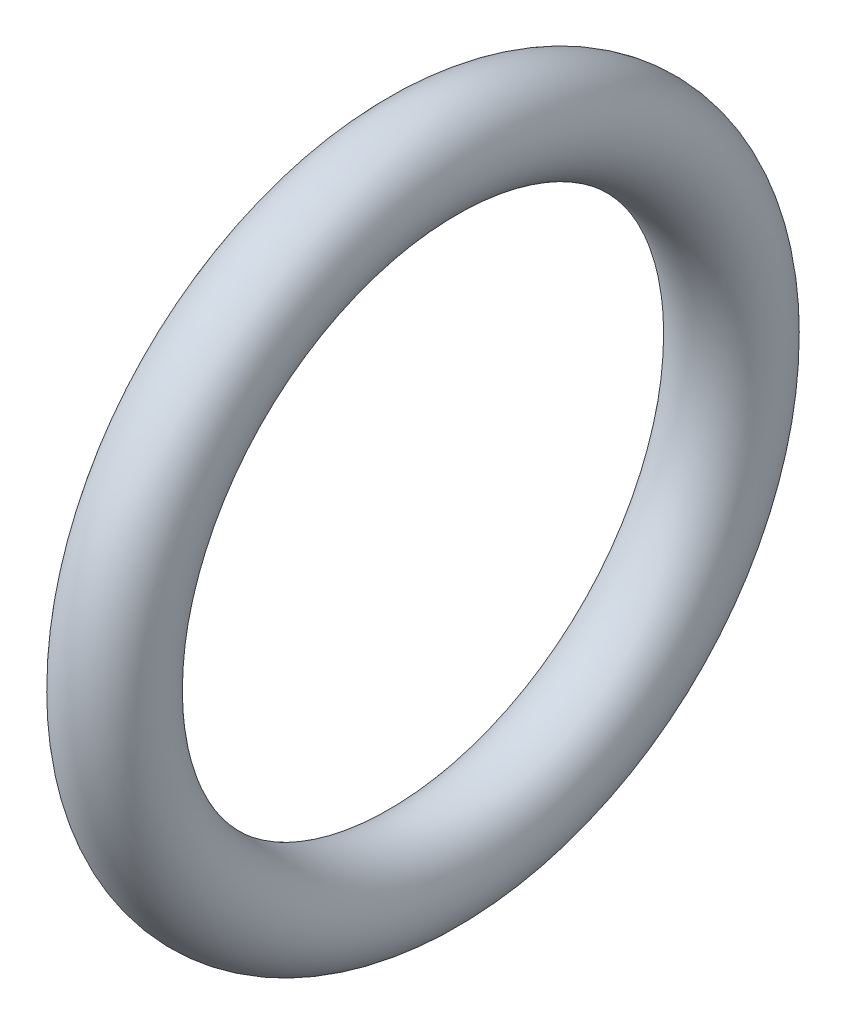
ISO-10303-21;
HEADER;
FILE_DESCRIPTION(('STEP AP214'),'2;1');
FILE_NAME('part.step','',(''),(''),'','','');
FILE_SCHEMA(('AUTOMOTIVE_DESIGN { 1 0 10303 214 1 1 1 1 }'));
ENDSEC;
DATA;
#1=APPLICATION_CONTEXT('core data for automotive mechanical design processes');
#2=APPLICATION_PROTOCOL_DEFINITION('international standard','automotive_design',2000,#1);
#3=PRODUCT_CONTEXT('',#1,'mechanical');
#4=PRODUCT('Part','Part','',(#3));
#5=PRODUCT_RELATED_PRODUCT_CATEGORY('part','',(#4));
#6=PRODUCT_DEFINITION_FORMATION('','',#4);
#7=PRODUCT_DEFINITION_CONTEXT('part definition',#1,'design');
#8=PRODUCT_DEFINITION('design','',#6,#7);
#9=PRODUCT_DEFINITION_SHAPE('','',#8);
#10=(LENGTH_UNIT() NAMED_UNIT(*) SI_UNIT(.MILLI.,.METRE.));
#11=(NAMED_UNIT(*) PLANE_ANGLE_UNIT() SI_UNIT($,.RADIAN.));
#12=(NAMED_UNIT(*) SI_UNIT($,.STERADIAN.) SOLID_ANGLE_UNIT());
#13=UNCERTAINTY_MEASURE_WITH_UNIT(LENGTH_MEASURE(1.E-05),#10,'distance_accuracy_value','');
#14=(GEOMETRIC_REPRESENTATION_CONTEXT(3) GLOBAL_UNCERTAINTY_ASSIGNED_CONTEXT((#13)) GLOBAL_UNIT_ASSIGNED_CONTEXT((#10,
#11,#12)) REPRESENTATION_CONTEXT('',''));
#15=CARTESIAN_POINT('',(0.,0.,0.));
#16=DIRECTION('',(0.,0.,1.));
#17=DIRECTION('',(1.,0.,0.));
#18=AXIS2_PLACEMENT_3D('',#15,#16,#17);
#19=CARTESIAN_POINT('',(0.,0.,0.));
#20=DIRECTION('',(1.,0.,0.));
#21=DIRECTION('',(0.,0.,-1.));
#22=AXIS2_PLACEMENT_3D('',#19,#20,#21);
#23=TOROIDAL_SURFACE('',#22,9.,1.4);
#24=CARTESIAN_POINT('',(0.,0.,-10.4));
#25=VERTEX_POINT('',#24);
#26=VERTEX_LOOP('',#25);
#27=FACE_BOUND('',#26,.T.);
#28=ADVANCED_FACE('F29',(#27),#23,.T.);
#29=CLOSED_SHELL('',(#28));
#30=MANIFOLD_SOLID_BREP('B2',#29);
#31=ADVANCED_BREP_SHAPE_REPRESENTATION('',(#18,#30),#14);
#32=SHAPE_DEFINITION_REPRESENTATION(#9,#31);
ENDSEC;
END-ISO-10303-21;
